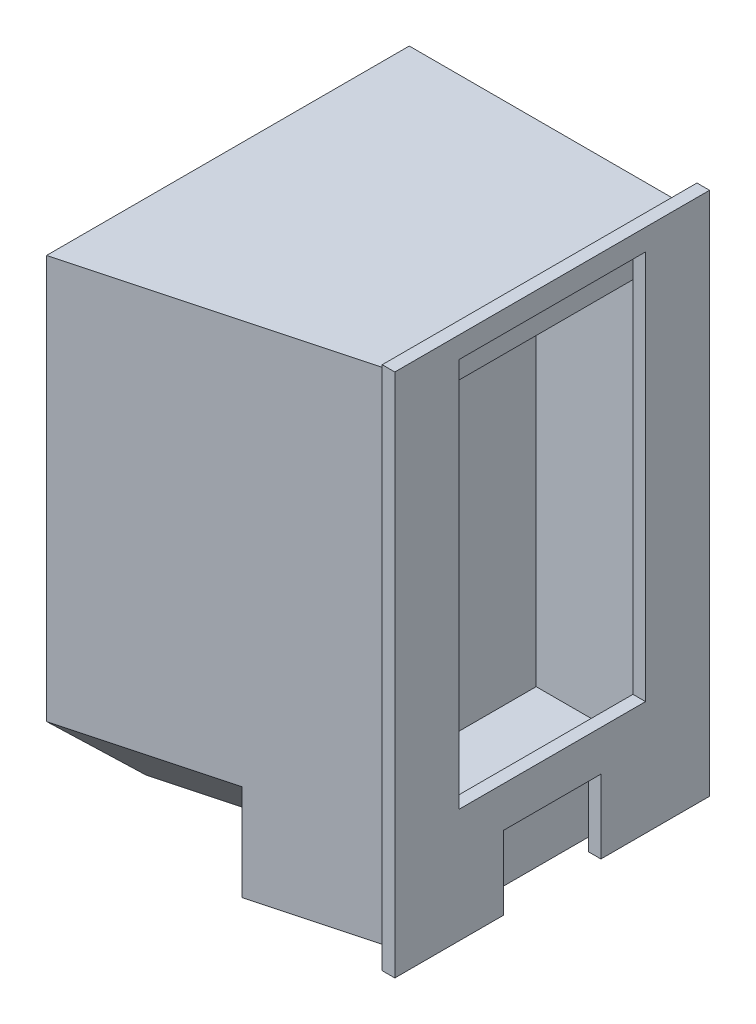
ISO-10303-21;
HEADER;
FILE_DESCRIPTION(('STEP AP214'),'2;1');
FILE_NAME('part.step','',(''),(''),'','','');
FILE_SCHEMA(('AUTOMOTIVE_DESIGN { 1 0 10303 214 1 1 1 1 }'));
ENDSEC;
DATA;
#1=APPLICATION_CONTEXT('core data for automotive mechanical design processes');
#2=APPLICATION_PROTOCOL_DEFINITION('international standard','automotive_design',2000,#1);
#3=PRODUCT_CONTEXT('',#1,'mechanical');
#4=PRODUCT('Part','Part','',(#3));
#5=PRODUCT_RELATED_PRODUCT_CATEGORY('part','',(#4));
#6=PRODUCT_DEFINITION_FORMATION('','',#4);
#7=PRODUCT_DEFINITION_CONTEXT('part definition',#1,'design');
#8=PRODUCT_DEFINITION('design','',#6,#7);
#9=PRODUCT_DEFINITION_SHAPE('','',#8);
#10=(LENGTH_UNIT() NAMED_UNIT(*) SI_UNIT(.MILLI.,.METRE.));
#11=(NAMED_UNIT(*) PLANE_ANGLE_UNIT() SI_UNIT($,.RADIAN.));
#12=(NAMED_UNIT(*) SI_UNIT($,.STERADIAN.) SOLID_ANGLE_UNIT());
#13=UNCERTAINTY_MEASURE_WITH_UNIT(LENGTH_MEASURE(1.E-05),#10,'distance_accuracy_value','');
#14=(GEOMETRIC_REPRESENTATION_CONTEXT(3) GLOBAL_UNCERTAINTY_ASSIGNED_CONTEXT((#13)) GLOBAL_UNIT_ASSIGNED_CONTEXT((#10,
#11,#12)) REPRESENTATION_CONTEXT('',''));
#15=CARTESIAN_POINT('',(0.,0.,0.));
#16=DIRECTION('',(0.,0.,1.));
#17=DIRECTION('',(1.,0.,0.));
#18=AXIS2_PLACEMENT_3D('',#15,#16,#17);
#19=CARTESIAN_POINT('',(15.3052314877297,0.,0.));
#20=DIRECTION('',(1.,0.,0.));
#21=DIRECTION('',(0.,0.,-1.));
#22=AXIS2_PLACEMENT_3D('',#19,#20,#21);
#23=PLANE('',#22);
#24=DIRECTION('',(0.,1.,0.));
#25=VECTOR('',#24,1.);
#26=CARTESIAN_POINT('',(15.3052314877297,521.318653049981,217.579868937785));
#27=LINE('',#26,#25);
#28=CARTESIAN_POINT('',(15.3052314877297,-103.291624688066,217.579868937784));
#29=VERTEX_POINT('',#28);
#30=CARTESIAN_POINT('',(15.3052314877297,521.318653049981,217.579868937785));
#31=VERTEX_POINT('',#30);
#32=EDGE_CURVE('E191',#29,#31,#27,.T.);
#33=ORIENTED_EDGE('',*,*,#32,.T.);
#34=DIRECTION('',(0.,0.,1.));
#35=VECTOR('',#34,1.);
#36=CARTESIAN_POINT('',(15.3052314877297,521.318653049981,217.579868937785));
#37=LINE('',#36,#35);
#38=CARTESIAN_POINT('',(15.3052314877297,521.318653049981,592.157167093429));
#39=VERTEX_POINT('',#38);
#40=EDGE_CURVE('E195',#31,#39,#37,.T.);
#41=ORIENTED_EDGE('',*,*,#40,.T.);
#42=DIRECTION('',(0.,-1.,0.));
#43=VECTOR('',#42,1.);
#44=CARTESIAN_POINT('',(15.3052314877297,521.318653049981,592.157167093429));
#45=LINE('',#44,#43);
#46=CARTESIAN_POINT('',(15.3052314877297,-103.291624688066,592.157167093429));
#47=VERTEX_POINT('',#46);
#48=EDGE_CURVE('E199',#39,#47,#45,.T.);
#49=ORIENTED_EDGE('',*,*,#48,.T.);
#50=DIRECTION('',(0.,0.,-1.));
#51=VECTOR('',#50,1.);
#52=CARTESIAN_POINT('',(15.3052314877297,-103.291624688066,592.157167093429));
#53=LINE('',#52,#51);
#54=CARTESIAN_POINT('',(15.3052314877297,-103.291624688066,462.868518015606));
#55=VERTEX_POINT('',#54);
#56=EDGE_CURVE('E202',#47,#55,#53,.T.);
#57=ORIENTED_EDGE('',*,*,#56,.T.);
#58=DIRECTION('',(0.,1.,0.));
#59=VECTOR('',#58,1.);
#60=CARTESIAN_POINT('',(15.3052314877297,-15.7916246880659,462.868518015606));
#61=LINE('',#60,#59);
#62=CARTESIAN_POINT('',(15.3052314877297,-15.7916246880659,462.868518015606));
#63=VERTEX_POINT('',#62);
#64=EDGE_CURVE('E205',#55,#63,#61,.T.);
#65=ORIENTED_EDGE('',*,*,#64,.T.);
#66=DIRECTION('',(0.,0.,-1.));
#67=VECTOR('',#66,1.);
#68=CARTESIAN_POINT('',(15.3052314877297,-15.7916246880659,462.868518015606));
#69=LINE('',#68,#67);
#70=CARTESIAN_POINT('',(15.3052314877297,-15.7916246880659,346.868518015606));
#71=VERTEX_POINT('',#70);
#72=EDGE_CURVE('E208',#63,#71,#69,.T.);
#73=ORIENTED_EDGE('',*,*,#72,.T.);
#74=DIRECTION('',(0.,-1.,0.));
#75=VECTOR('',#74,1.);
#76=CARTESIAN_POINT('',(15.3052314877297,-15.7916246880659,346.868518015606));
#77=LINE('',#76,#75);
#78=CARTESIAN_POINT('',(15.3052314877297,-103.291624688066,346.868518015606));
#79=VERTEX_POINT('',#78);
#80=EDGE_CURVE('E211',#71,#79,#77,.T.);
#81=ORIENTED_EDGE('',*,*,#80,.T.);
#82=DIRECTION('',(0.,0.,-1.));
#83=VECTOR('',#82,1.);
#84=CARTESIAN_POINT('',(15.3052314877297,-103.291624688066,346.868518015606));
#85=LINE('',#84,#83);
#86=EDGE_CURVE('E214',#79,#29,#85,.T.);
#87=ORIENTED_EDGE('',*,*,#86,.T.);
#88=EDGE_LOOP('',(#33,#41,#49,#57,#65,#73,#81,#87));
#89=FACE_BOUND('',#88,.T.);
#90=DIRECTION('',(0.,0.,-1.));
#91=VECTOR('',#90,1.);
#92=CARTESIAN_POINT('',(15.3052314877297,32.3686530499808,293.743518015606));
#93=LINE('',#92,#91);
#94=CARTESIAN_POINT('',(15.3052314877297,32.3686530499807,515.993518015607));
#95=VERTEX_POINT('',#94);
#96=CARTESIAN_POINT('',(15.3052314877297,32.3686530499808,293.743518015606));
#97=VERTEX_POINT('',#96);
#98=EDGE_CURVE('E152',#95,#97,#93,.T.);
#99=ORIENTED_EDGE('',*,*,#98,.F.);
#100=DIRECTION('',(0.,-1.,0.));
#101=VECTOR('',#100,1.);
#102=CARTESIAN_POINT('',(15.3052314877297,32.3686530499807,515.993518015607));
#103=LINE('',#102,#101);
#104=CARTESIAN_POINT('',(15.3052314877297,495.918653049981,515.993518015606));
#105=VERTEX_POINT('',#104);
#106=EDGE_CURVE('E143',#105,#95,#103,.T.);
#107=ORIENTED_EDGE('',*,*,#106,.F.);
#108=DIRECTION('',(0.,0.,1.));
#109=VECTOR('',#108,1.);
#110=CARTESIAN_POINT('',(15.3052314877297,495.918653049981,293.743518015606));
#111=LINE('',#110,#109);
#112=CARTESIAN_POINT('',(15.3052314877297,495.918653049981,293.743518015606));
#113=VERTEX_POINT('',#112);
#114=EDGE_CURVE('E169',#113,#105,#111,.T.);
#115=ORIENTED_EDGE('',*,*,#114,.F.);
#116=DIRECTION('',(0.,1.,0.));
#117=VECTOR('',#116,1.);
#118=CARTESIAN_POINT('',(15.3052314877297,32.3686530499808,293.743518015606));
#119=LINE('',#118,#117);
#120=EDGE_CURVE('E165',#97,#113,#119,.T.);
#121=ORIENTED_EDGE('',*,*,#120,.F.);
#122=EDGE_LOOP('',(#99,#107,#115,#121));
#123=FACE_BOUND('',#122,.T.);
#124=ADVANCED_FACE('F53',(#89,#123),#23,.T.);
#125=CARTESIAN_POINT('',(0.305231487729651,0.,0.));
#126=DIRECTION('',(1.,0.,0.));
#127=DIRECTION('',(0.,0.,-1.));
#128=AXIS2_PLACEMENT_3D('',#125,#126,#127);
#129=PLANE('',#128);
#130=DIRECTION('',(0.,1.,0.));
#131=VECTOR('',#130,1.);
#132=CARTESIAN_POINT('',(0.305231487729651,521.318653049981,217.579868937785));
#133=LINE('',#132,#131);
#134=CARTESIAN_POINT('',(0.305231487729651,-103.291624688066,217.579868937784));
#135=VERTEX_POINT('',#134);
#136=CARTESIAN_POINT('',(0.305231487729651,521.318653049981,217.579868937785));
#137=VERTEX_POINT('',#136);
#138=EDGE_CURVE('E161',#135,#137,#133,.T.);
#139=ORIENTED_EDGE('',*,*,#138,.F.);
#140=DIRECTION('',(0.,0.,-1.));
#141=VECTOR('',#140,1.);
#142=CARTESIAN_POINT('',(0.305231487729651,-103.291624688066,346.868518015606));
#143=LINE('',#142,#141);
#144=CARTESIAN_POINT('',(0.305231487729651,-103.291624688066,346.868518015606));
#145=VERTEX_POINT('',#144);
#146=EDGE_CURVE('E196',#145,#135,#143,.T.);
#147=ORIENTED_EDGE('',*,*,#146,.F.);
#148=DIRECTION('',(0.,-1.,0.));
#149=VECTOR('',#148,1.);
#150=CARTESIAN_POINT('',(0.305231487729651,-15.7916246880659,346.868518015606));
#151=LINE('',#150,#149);
#152=CARTESIAN_POINT('',(0.305231487729651,-15.7916246880659,346.868518015606));
#153=VERTEX_POINT('',#152);
#154=EDGE_CURVE('E236',#153,#145,#151,.T.);
#155=ORIENTED_EDGE('',*,*,#154,.F.);
#156=DIRECTION('',(0.,0.,-1.));
#157=VECTOR('',#156,1.);
#158=CARTESIAN_POINT('',(0.305231487729651,-15.7916246880659,462.868518015606));
#159=LINE('',#158,#157);
#160=CARTESIAN_POINT('',(0.305231487729651,-15.7916246880659,462.868518015606));
#161=VERTEX_POINT('',#160);
#162=EDGE_CURVE('E233',#161,#153,#159,.T.);
#163=ORIENTED_EDGE('',*,*,#162,.F.);
#164=DIRECTION('',(0.,1.,0.));
#165=VECTOR('',#164,1.);
#166=CARTESIAN_POINT('',(0.305231487729651,-15.7916246880659,462.868518015606));
#167=LINE('',#166,#165);
#168=CARTESIAN_POINT('',(0.305231487729651,-103.291624688066,462.868518015606));
#169=VERTEX_POINT('',#168);
#170=EDGE_CURVE('E230',#169,#161,#167,.T.);
#171=ORIENTED_EDGE('',*,*,#170,.F.);
#172=DIRECTION('',(0.,0.,-1.));
#173=VECTOR('',#172,1.);
#174=CARTESIAN_POINT('',(0.305231487729651,-103.291624688066,592.157167093429));
#175=LINE('',#174,#173);
#176=CARTESIAN_POINT('',(0.305231487729651,-103.291624688066,592.157167093429));
#177=VERTEX_POINT('',#176);
#178=EDGE_CURVE('E227',#177,#169,#175,.T.);
#179=ORIENTED_EDGE('',*,*,#178,.F.);
#180=DIRECTION('',(0.,-1.,0.));
#181=VECTOR('',#180,1.);
#182=CARTESIAN_POINT('',(0.305231487729651,521.318653049981,592.157167093429));
#183=LINE('',#182,#181);
#184=CARTESIAN_POINT('',(0.305231487729651,521.318653049981,592.157167093429));
#185=VERTEX_POINT('',#184);
#186=EDGE_CURVE('E224',#185,#177,#183,.T.);
#187=ORIENTED_EDGE('',*,*,#186,.F.);
#188=DIRECTION('',(0.,0.,1.));
#189=VECTOR('',#188,1.);
#190=CARTESIAN_POINT('',(0.305231487729651,521.318653049981,217.579868937785));
#191=LINE('',#190,#189);
#192=EDGE_CURVE('E221',#137,#185,#191,.T.);
#193=ORIENTED_EDGE('',*,*,#192,.F.);
#194=EDGE_LOOP('',(#139,#147,#155,#163,#171,#179,#187,#193));
#195=FACE_BOUND('',#194,.T.);
#196=DIRECTION('',(0.,-1.,0.));
#197=VECTOR('',#196,1.);
#198=CARTESIAN_POINT('',(0.305231487729651,32.3686530499807,515.993518015607));
#199=LINE('',#198,#197);
#200=CARTESIAN_POINT('',(0.305231487729651,495.918653049981,515.993518015606));
#201=VERTEX_POINT('',#200);
#202=CARTESIAN_POINT('',(0.305231487729651,32.3686530499807,515.993518015607));
#203=VERTEX_POINT('',#202);
#204=EDGE_CURVE('E77',#201,#203,#199,.T.);
#205=ORIENTED_EDGE('',*,*,#204,.T.);
#206=DIRECTION('',(0.,0.,-1.));
#207=VECTOR('',#206,1.);
#208=CARTESIAN_POINT('',(0.305231487729651,32.3686530499808,293.743518015606));
#209=LINE('',#208,#207);
#210=CARTESIAN_POINT('',(0.305231487729651,32.3686530499808,293.743518015606));
#211=VERTEX_POINT('',#210);
#212=EDGE_CURVE('E159',#203,#211,#209,.T.);
#213=ORIENTED_EDGE('',*,*,#212,.T.);
#214=DIRECTION('',(0.,1.,0.));
#215=VECTOR('',#214,1.);
#216=CARTESIAN_POINT('',(0.305231487729651,32.3686530499808,293.743518015606));
#217=LINE('',#216,#215);
#218=CARTESIAN_POINT('',(0.305231487729651,495.918653049981,293.743518015606));
#219=VERTEX_POINT('',#218);
#220=EDGE_CURVE('E178',#211,#219,#217,.T.);
#221=ORIENTED_EDGE('',*,*,#220,.T.);
#222=DIRECTION('',(0.,0.,1.));
#223=VECTOR('',#222,1.);
#224=CARTESIAN_POINT('',(0.305231487729651,495.918653049981,293.743518015606));
#225=LINE('',#224,#223);
#226=EDGE_CURVE('E153',#219,#201,#225,.T.);
#227=ORIENTED_EDGE('',*,*,#226,.T.);
#228=EDGE_LOOP('',(#205,#213,#221,#227));
#229=FACE_BOUND('',#228,.T.);
#230=ADVANCED_FACE('F275',(#195,#229),#129,.F.);
#231=CARTESIAN_POINT('',(15.3052314877297,521.318653049981,217.579868937785));
#232=DIRECTION('',(0.,0.,1.));
#233=DIRECTION('',(0.,-1.,0.));
#234=AXIS2_PLACEMENT_3D('',#231,#232,#233);
#235=PLANE('',#234);
#236=ORIENTED_EDGE('',*,*,#138,.T.);
#237=DIRECTION('',(-1.,0.,0.));
#238=VECTOR('',#237,1.);
#239=CARTESIAN_POINT('',(15.3052314877297,521.318653049981,217.579868937785));
#240=LINE('',#239,#238);
#241=EDGE_CURVE('E12',#31,#137,#240,.T.);
#242=ORIENTED_EDGE('',*,*,#241,.F.);
#243=ORIENTED_EDGE('',*,*,#32,.F.);
#244=DIRECTION('',(-1.,0.,0.));
#245=VECTOR('',#244,1.);
#246=CARTESIAN_POINT('',(15.3052314877297,-103.291624688066,217.579868937784));
#247=LINE('',#246,#245);
#248=EDGE_CURVE('E217',#29,#135,#247,.T.);
#249=ORIENTED_EDGE('',*,*,#248,.T.);
#250=EDGE_LOOP('',(#236,#242,#243,#249));
#251=FACE_BOUND('',#250,.T.);
#252=ADVANCED_FACE('F55',(#251),#235,.F.);
#253=CARTESIAN_POINT('',(15.3052314877297,521.318653049981,217.579868937785));
#254=DIRECTION('',(0.,-1.,0.));
#255=DIRECTION('',(0.,0.,-1.));
#256=AXIS2_PLACEMENT_3D('',#253,#254,#255);
#257=PLANE('',#256);
#258=ORIENTED_EDGE('',*,*,#192,.T.);
#259=DIRECTION('',(-1.,0.,0.));
#260=VECTOR('',#259,1.);
#261=CARTESIAN_POINT('',(15.3052314877297,521.318653049981,592.157167093429));
#262=LINE('',#261,#260);
#263=EDGE_CURVE('E62',#39,#185,#262,.T.);
#264=ORIENTED_EDGE('',*,*,#263,.F.);
#265=ORIENTED_EDGE('',*,*,#40,.F.);
#266=ORIENTED_EDGE('',*,*,#241,.T.);
#267=EDGE_LOOP('',(#258,#264,#265,#266));
#268=FACE_BOUND('',#267,.T.);
#269=ADVANCED_FACE('F292',(#268),#257,.F.);
#270=CARTESIAN_POINT('',(15.3052314877297,521.318653049981,592.157167093429));
#271=DIRECTION('',(0.,0.,-1.));
#272=DIRECTION('',(0.,1.,0.));
#273=AXIS2_PLACEMENT_3D('',#270,#271,#272);
#274=PLANE('',#273);
#275=ORIENTED_EDGE('',*,*,#186,.T.);
#276=DIRECTION('',(-1.,0.,0.));
#277=VECTOR('',#276,1.);
#278=CARTESIAN_POINT('',(15.3052314877297,-103.291624688066,592.157167093429));
#279=LINE('',#278,#277);
#280=EDGE_CURVE('E260',#47,#177,#279,.T.);
#281=ORIENTED_EDGE('',*,*,#280,.F.);
#282=ORIENTED_EDGE('',*,*,#48,.F.);
#283=ORIENTED_EDGE('',*,*,#263,.T.);
#284=EDGE_LOOP('',(#275,#281,#282,#283));
#285=FACE_BOUND('',#284,.T.);
#286=ADVANCED_FACE('F269',(#285),#274,.F.);
#287=CARTESIAN_POINT('',(15.3052314877297,-103.291624688066,592.157167093429));
#288=DIRECTION('',(0.,1.,0.));
#289=DIRECTION('',(0.,0.,1.));
#290=AXIS2_PLACEMENT_3D('',#287,#288,#289);
#291=PLANE('',#290);
#292=ORIENTED_EDGE('',*,*,#178,.T.);
#293=DIRECTION('',(-1.,0.,0.));
#294=VECTOR('',#293,1.);
#295=CARTESIAN_POINT('',(15.3052314877297,-103.291624688066,462.868518015606));
#296=LINE('',#295,#294);
#297=EDGE_CURVE('E256',#55,#169,#296,.T.);
#298=ORIENTED_EDGE('',*,*,#297,.F.);
#299=ORIENTED_EDGE('',*,*,#56,.F.);
#300=ORIENTED_EDGE('',*,*,#280,.T.);
#301=EDGE_LOOP('',(#292,#298,#299,#300));
#302=FACE_BOUND('',#301,.T.);
#303=ADVANCED_FACE('F281',(#302),#291,.F.);
#304=CARTESIAN_POINT('',(15.3052314877297,-15.7916246880659,462.868518015606));
#305=DIRECTION('',(0.,0.,1.));
#306=DIRECTION('',(1.,0.,0.));
#307=AXIS2_PLACEMENT_3D('',#304,#305,#306);
#308=PLANE('',#307);
#309=ORIENTED_EDGE('',*,*,#170,.T.);
#310=DIRECTION('',(-1.,0.,0.));
#311=VECTOR('',#310,1.);
#312=CARTESIAN_POINT('',(15.3052314877297,-15.7916246880659,462.868518015606));
#313=LINE('',#312,#311);
#314=EDGE_CURVE('E252',#63,#161,#313,.T.);
#315=ORIENTED_EDGE('',*,*,#314,.F.);
#316=ORIENTED_EDGE('',*,*,#64,.F.);
#317=ORIENTED_EDGE('',*,*,#297,.T.);
#318=EDGE_LOOP('',(#309,#315,#316,#317));
#319=FACE_BOUND('',#318,.T.);
#320=ADVANCED_FACE('F285',(#319),#308,.F.);
#321=CARTESIAN_POINT('',(15.3052314877297,-15.7916246880659,462.868518015606));
#322=DIRECTION('',(0.,1.,0.));
#323=DIRECTION('',(0.,0.,1.));
#324=AXIS2_PLACEMENT_3D('',#321,#322,#323);
#325=PLANE('',#324);
#326=ORIENTED_EDGE('',*,*,#162,.T.);
#327=DIRECTION('',(-1.,0.,0.));
#328=VECTOR('',#327,1.);
#329=CARTESIAN_POINT('',(15.3052314877297,-15.7916246880659,346.868518015606));
#330=LINE('',#329,#328);
#331=EDGE_CURVE('E248',#71,#153,#330,.T.);
#332=ORIENTED_EDGE('',*,*,#331,.F.);
#333=ORIENTED_EDGE('',*,*,#72,.F.);
#334=ORIENTED_EDGE('',*,*,#314,.T.);
#335=EDGE_LOOP('',(#326,#332,#333,#334));
#336=FACE_BOUND('',#335,.T.);
#337=ADVANCED_FACE('F305',(#336),#325,.F.);
#338=CARTESIAN_POINT('',(15.3052314877297,-15.7916246880659,346.868518015606));
#339=DIRECTION('',(0.,0.,-1.));
#340=DIRECTION('',(-1.,0.,0.));
#341=AXIS2_PLACEMENT_3D('',#338,#339,#340);
#342=PLANE('',#341);
#343=ORIENTED_EDGE('',*,*,#154,.T.);
#344=DIRECTION('',(-1.,0.,0.));
#345=VECTOR('',#344,1.);
#346=CARTESIAN_POINT('',(15.3052314877297,-103.291624688066,346.868518015606));
#347=LINE('',#346,#345);
#348=EDGE_CURVE('E244',#79,#145,#347,.T.);
#349=ORIENTED_EDGE('',*,*,#348,.F.);
#350=ORIENTED_EDGE('',*,*,#80,.F.);
#351=ORIENTED_EDGE('',*,*,#331,.T.);
#352=EDGE_LOOP('',(#343,#349,#350,#351));
#353=FACE_BOUND('',#352,.T.);
#354=ADVANCED_FACE('F303',(#353),#342,.F.);
#355=CARTESIAN_POINT('',(15.3052314877297,-103.291624688066,346.868518015606));
#356=DIRECTION('',(0.,1.,0.));
#357=DIRECTION('',(0.,0.,1.));
#358=AXIS2_PLACEMENT_3D('',#355,#356,#357);
#359=PLANE('',#358);
#360=ORIENTED_EDGE('',*,*,#146,.T.);
#361=ORIENTED_EDGE('',*,*,#248,.F.);
#362=ORIENTED_EDGE('',*,*,#86,.F.);
#363=ORIENTED_EDGE('',*,*,#348,.T.);
#364=EDGE_LOOP('',(#360,#361,#362,#363));
#365=FACE_BOUND('',#364,.T.);
#366=ADVANCED_FACE('F298',(#365),#359,.F.);
#367=CARTESIAN_POINT('',(15.3052314877297,32.3686530499807,515.993518015607));
#368=DIRECTION('',(0.,0.,-1.));
#369=DIRECTION('',(0.,1.,0.));
#370=AXIS2_PLACEMENT_3D('',#367,#368,#369);
#371=PLANE('',#370);
#372=ORIENTED_EDGE('',*,*,#204,.F.);
#373=DIRECTION('',(-1.,0.,0.));
#374=VECTOR('',#373,1.);
#375=CARTESIAN_POINT('',(15.3052314877297,495.918653049981,515.993518015606));
#376=LINE('',#375,#374);
#377=EDGE_CURVE('E147',#105,#201,#376,.T.);
#378=ORIENTED_EDGE('',*,*,#377,.F.);
#379=ORIENTED_EDGE('',*,*,#106,.T.);
#380=DIRECTION('',(-1.,0.,0.));
#381=VECTOR('',#380,1.);
#382=CARTESIAN_POINT('',(15.3052314877297,32.3686530499807,515.993518015607));
#383=LINE('',#382,#381);
#384=EDGE_CURVE('E146',#95,#203,#383,.T.);
#385=ORIENTED_EDGE('',*,*,#384,.T.);
#386=EDGE_LOOP('',(#372,#378,#379,#385));
#387=FACE_BOUND('',#386,.T.);
#388=ADVANCED_FACE('F145',(#387),#371,.T.);
#389=CARTESIAN_POINT('',(15.3052314877297,32.3686530499808,293.743518015606));
#390=DIRECTION('',(0.,1.,0.));
#391=DIRECTION('',(0.,0.,1.));
#392=AXIS2_PLACEMENT_3D('',#389,#390,#391);
#393=PLANE('',#392);
#394=ORIENTED_EDGE('',*,*,#212,.F.);
#395=ORIENTED_EDGE('',*,*,#384,.F.);
#396=ORIENTED_EDGE('',*,*,#98,.T.);
#397=DIRECTION('',(-1.,0.,0.));
#398=VECTOR('',#397,1.);
#399=CARTESIAN_POINT('',(15.3052314877297,32.3686530499808,293.743518015606));
#400=LINE('',#399,#398);
#401=EDGE_CURVE('E162',#97,#211,#400,.T.);
#402=ORIENTED_EDGE('',*,*,#401,.T.);
#403=EDGE_LOOP('',(#394,#395,#396,#402));
#404=FACE_BOUND('',#403,.T.);
#405=ADVANCED_FACE('F156',(#404),#393,.T.);
#406=CARTESIAN_POINT('',(15.3052314877297,32.3686530499808,293.743518015606));
#407=DIRECTION('',(0.,0.,1.));
#408=DIRECTION('',(0.,-1.,0.));
#409=AXIS2_PLACEMENT_3D('',#406,#407,#408);
#410=PLANE('',#409);
#411=ORIENTED_EDGE('',*,*,#220,.F.);
#412=ORIENTED_EDGE('',*,*,#401,.F.);
#413=ORIENTED_EDGE('',*,*,#120,.T.);
#414=DIRECTION('',(-1.,0.,0.));
#415=VECTOR('',#414,1.);
#416=CARTESIAN_POINT('',(15.3052314877297,495.918653049981,293.743518015606));
#417=LINE('',#416,#415);
#418=EDGE_CURVE('E69',#113,#219,#417,.T.);
#419=ORIENTED_EDGE('',*,*,#418,.T.);
#420=EDGE_LOOP('',(#411,#412,#413,#419));
#421=FACE_BOUND('',#420,.T.);
#422=ADVANCED_FACE('F330',(#421),#410,.T.);
#423=CARTESIAN_POINT('',(15.3052314877297,495.918653049981,293.743518015606));
#424=DIRECTION('',(0.,-1.,0.));
#425=DIRECTION('',(0.,0.,-1.));
#426=AXIS2_PLACEMENT_3D('',#423,#424,#425);
#427=PLANE('',#426);
#428=ORIENTED_EDGE('',*,*,#226,.F.);
#429=ORIENTED_EDGE('',*,*,#418,.F.);
#430=ORIENTED_EDGE('',*,*,#114,.T.);
#431=ORIENTED_EDGE('',*,*,#377,.T.);
#432=EDGE_LOOP('',(#428,#429,#430,#431));
#433=FACE_BOUND('',#432,.T.);
#434=ADVANCED_FACE('F334',(#433),#427,.T.);
#435=CLOSED_SHELL('',(#124,#230,#252,#269,#286,#303,#320,#337,#354,#366,#388,#405,#422,#434));
#436=MANIFOLD_SOLID_BREP('B2',#435);
#437=CARTESIAN_POINT('',(-327.080348727841,506.318653049981,232.579868937784));
#438=DIRECTION('',(1.,0.,0.));
#439=DIRECTION('',(0.,0.,-1.));
#440=AXIS2_PLACEMENT_3D('',#437,#438,#439);
#441=PLANE('',#440);
#442=DIRECTION('',(0.,0.,-1.));
#443=VECTOR('',#442,1.);
#444=CARTESIAN_POINT('',(-327.080348727841,21.2583753119342,573.479868937784));
#445=LINE('',#444,#443);
#446=CARTESIAN_POINT('',(-327.080348727841,21.2583753119341,573.479868937784));
#447=VERTEX_POINT('',#446);
#448=CARTESIAN_POINT('',(-327.080348727841,21.2583753119342,323.479868937785));
#449=VERTEX_POINT('',#448);
#450=EDGE_CURVE('E618',#447,#449,#445,.T.);
#451=ORIENTED_EDGE('',*,*,#450,.T.);
#452=DIRECTION('',(0.,1.,0.));
#453=VECTOR('',#452,1.);
#454=CARTESIAN_POINT('',(-327.080348727841,221.258375311934,323.479868937785));
#455=LINE('',#454,#453);
#456=CARTESIAN_POINT('',(-327.080348727841,221.258375311934,323.479868937785));
#457=VERTEX_POINT('',#456);
#458=EDGE_CURVE('E638',#449,#457,#455,.T.);
#459=ORIENTED_EDGE('',*,*,#458,.T.);
#460=DIRECTION('',(0.,0.,1.));
#461=VECTOR('',#460,1.);
#462=CARTESIAN_POINT('',(-327.080348727841,221.258375311934,573.479868937784));
#463=LINE('',#462,#461);
#464=CARTESIAN_POINT('',(-327.080348727841,221.258375311934,573.479868937784));
#465=VERTEX_POINT('',#464);
#466=EDGE_CURVE('E641',#457,#465,#463,.T.);
#467=ORIENTED_EDGE('',*,*,#466,.T.);
#468=DIRECTION('',(0.,-1.,0.));
#469=VECTOR('',#468,1.);
#470=CARTESIAN_POINT('',(-327.080348727841,221.258375311934,573.479868937784));
#471=LINE('',#470,#469);
#472=EDGE_CURVE('E629',#465,#447,#471,.T.);
#473=ORIENTED_EDGE('',*,*,#472,.T.);
#474=EDGE_LOOP('',(#451,#459,#467,#473));
#475=FACE_BOUND('',#474,.T.);
#476=DIRECTION('',(0.,0.,1.));
#477=VECTOR('',#476,1.);
#478=CARTESIAN_POINT('',(-327.080348727841,350.023375311934,498.479868937784));
#479=LINE('',#478,#477);
#480=CARTESIAN_POINT('',(-327.080348727841,350.023375311934,398.479868937784));
#481=VERTEX_POINT('',#480);
#482=CARTESIAN_POINT('',(-327.080348727841,350.023375311934,498.479868937784));
#483=VERTEX_POINT('',#482);
#484=EDGE_CURVE('E608',#481,#483,#479,.T.);
#485=ORIENTED_EDGE('',*,*,#484,.F.);
#486=DIRECTION('',(0.,-1.,0.));
#487=VECTOR('',#486,1.);
#488=CARTESIAN_POINT('',(-327.080348727841,350.023375311934,398.479868937784));
#489=LINE('',#488,#487);
#490=CARTESIAN_POINT('',(-327.080348727841,450.023375311934,398.479868937784));
#491=VERTEX_POINT('',#490);
#492=EDGE_CURVE('E591',#491,#481,#489,.T.);
#493=ORIENTED_EDGE('',*,*,#492,.F.);
#494=DIRECTION('',(0.,0.,-1.));
#495=VECTOR('',#494,1.);
#496=CARTESIAN_POINT('',(-327.080348727841,450.023375311934,498.479868937784));
#497=LINE('',#496,#495);
#498=CARTESIAN_POINT('',(-327.080348727841,450.023375311934,498.479868937784));
#499=VERTEX_POINT('',#498);
#500=EDGE_CURVE('E597',#499,#491,#497,.T.);
#501=ORIENTED_EDGE('',*,*,#500,.F.);
#502=DIRECTION('',(0.,1.,0.));
#503=VECTOR('',#502,1.);
#504=CARTESIAN_POINT('',(-327.080348727841,350.023375311934,498.479868937784));
#505=LINE('',#504,#503);
#506=EDGE_CURVE('E611',#483,#499,#505,.T.);
#507=ORIENTED_EDGE('',*,*,#506,.F.);
#508=EDGE_LOOP('',(#485,#493,#501,#507));
#509=FACE_BOUND('',#508,.T.);
#510=DIRECTION('',(0.,-0.694746590606866,-0.719254596676403));
#511=VECTOR('',#510,1.);
#512=CARTESIAN_POINT('',(-327.080348727841,42.0707727069249,681.008886361099));
#513=LINE('',#512,#511);
#514=CARTESIAN_POINT('',(-327.080348727841,26.0083753119342,664.379868937784));
#515=VERTEX_POINT('',#514);
#516=CARTESIAN_POINT('',(-327.080348727841,-88.2916246880659,546.047801516912));
#517=VERTEX_POINT('',#516);
#518=EDGE_CURVE('E576',#515,#517,#513,.T.);
#519=ORIENTED_EDGE('',*,*,#518,.F.);
#520=DIRECTION('',(0.,-1.,0.));
#521=VECTOR('',#520,1.);
#522=CARTESIAN_POINT('',(-327.080348727841,506.318653049981,664.379868937784));
#523=LINE('',#522,#521);
#524=CARTESIAN_POINT('',(-327.080348727841,506.318653049981,664.379868937784));
#525=VERTEX_POINT('',#524);
#526=EDGE_CURVE('E51',#525,#515,#523,.T.);
#527=ORIENTED_EDGE('',*,*,#526,.F.);
#528=DIRECTION('',(0.,0.,1.));
#529=VECTOR('',#528,1.);
#530=CARTESIAN_POINT('',(-327.080348727841,506.318653049981,232.579868937784));
#531=LINE('',#530,#529);
#532=CARTESIAN_POINT('',(-327.080348727841,506.318653049981,232.579868937784));
#533=VERTEX_POINT('',#532);
#534=EDGE_CURVE('E688',#533,#525,#531,.T.);
#535=ORIENTED_EDGE('',*,*,#534,.F.);
#536=DIRECTION('',(0.,-1.,0.));
#537=VECTOR('',#536,1.);
#538=CARTESIAN_POINT('',(-327.080348727841,506.318653049981,232.579868937784));
#539=LINE('',#538,#537);
#540=CARTESIAN_POINT('',(-327.080348727841,26.0083753119342,232.579868937784));
#541=VERTEX_POINT('',#540);
#542=EDGE_CURVE('E698',#533,#541,#539,.T.);
#543=ORIENTED_EDGE('',*,*,#542,.T.);
#544=DIRECTION('',(0.,0.707106781186548,-0.707106781186548));
#545=VECTOR('',#544,1.);
#546=CARTESIAN_POINT('',(-327.080348727841,26.0083753119342,232.579868937784));
#547=LINE('',#546,#545);
#548=CARTESIAN_POINT('',(-327.080348727841,-88.2916246880658,346.879868937784));
#549=VERTEX_POINT('',#548);
#550=EDGE_CURVE('E580',#549,#541,#547,.T.);
#551=ORIENTED_EDGE('',*,*,#550,.F.);
#552=DIRECTION('',(0.,0.,1.));
#553=VECTOR('',#552,1.);
#554=CARTESIAN_POINT('',(-327.080348727841,-88.2916246880658,232.579868937784));
#555=LINE('',#554,#553);
#556=EDGE_CURVE('E681',#549,#517,#555,.T.);
#557=ORIENTED_EDGE('',*,*,#556,.T.);
#558=EDGE_LOOP('',(#519,#527,#535,#543,#551,#557));
#559=FACE_BOUND('',#558,.T.);
#560=ADVANCED_FACE('F423',(#475,#509,#559),#441,.F.);
#561=CARTESIAN_POINT('',(-327.080348727841,506.318653049981,664.379868937784));
#562=DIRECTION('',(-0.258819045102518,0.,-0.965925826289069));
#563=DIRECTION('',(-0.965925826289069,0.,0.258819045102518));
#564=AXIS2_PLACEMENT_3D('',#561,#562,#563);
#565=PLANE('',#564);
#566=DIRECTION('',(-0.965925826289069,0.,0.258819045102518));
#567=VECTOR('',#566,1.);
#568=CARTESIAN_POINT('',(-143.554441732918,26.0083753119342,615.204250368306));
#569=LINE('',#568,#567);
#570=CARTESIAN_POINT('',(-143.554441732918,26.0083753119342,615.204250368306));
#571=VERTEX_POINT('',#570);
#572=EDGE_CURVE('E561',#571,#515,#569,.T.);
#573=ORIENTED_EDGE('',*,*,#572,.F.);
#574=DIRECTION('',(0.,-1.,0.));
#575=VECTOR('',#574,1.);
#576=CARTESIAN_POINT('',(-143.554441732918,-88.2916246880658,615.204250368306));
#577=LINE('',#576,#575);
#578=CARTESIAN_POINT('',(-143.554441732918,-88.2916246880658,615.204250368306));
#579=VERTEX_POINT('',#578);
#580=EDGE_CURVE('E565',#571,#579,#577,.T.);
#581=ORIENTED_EDGE('',*,*,#580,.T.);
#582=DIRECTION('',(0.965925826289069,0.,-0.258819045102518));
#583=VECTOR('',#582,1.);
#584=CARTESIAN_POINT('',(-327.080348727841,-88.2916246880658,664.379868937784));
#585=LINE('',#584,#583);
#586=CARTESIAN_POINT('',(0.305231487729651,-88.2916246880658,576.657167105429));
#587=VERTEX_POINT('',#586);
#588=EDGE_CURVE('E701',#579,#587,#585,.T.);
#589=ORIENTED_EDGE('',*,*,#588,.T.);
#590=DIRECTION('',(0.,-1.,0.));
#591=VECTOR('',#590,1.);
#592=CARTESIAN_POINT('',(0.305231487729651,506.318653049981,576.657167105429));
#593=LINE('',#592,#591);
#594=CARTESIAN_POINT('',(0.305231487729651,506.318653049981,576.657167105429));
#595=VERTEX_POINT('',#594);
#596=EDGE_CURVE('E430',#595,#587,#593,.T.);
#597=ORIENTED_EDGE('',*,*,#596,.F.);
#598=DIRECTION('',(0.965925826289069,0.,-0.258819045102518));
#599=VECTOR('',#598,1.);
#600=CARTESIAN_POINT('',(-327.080348727841,506.318653049981,664.379868937784));
#601=LINE('',#600,#599);
#602=EDGE_CURVE('E691',#525,#595,#601,.T.);
#603=ORIENTED_EDGE('',*,*,#602,.F.);
#604=ORIENTED_EDGE('',*,*,#526,.T.);
#605=EDGE_LOOP('',(#573,#581,#589,#597,#603,#604));
#606=FACE_BOUND('',#605,.T.);
#607=ADVANCED_FACE('F573',(#606),#565,.F.);
#608=CARTESIAN_POINT('',(-327.080348727841,-88.2916246880658,232.579868937784));
#609=DIRECTION('',(0.,-1.,0.));
#610=DIRECTION('',(0.,0.,-1.));
#611=AXIS2_PLACEMENT_3D('',#608,#609,#610);
#612=PLANE('',#611);
#613=DIRECTION('',(-0.258819045102518,0.,-0.965925826289069));
#614=VECTOR('',#613,1.);
#615=CARTESIAN_POINT('',(-173.137458588136,-88.2916246880659,504.798928423465));
#616=LINE('',#615,#614);
#617=CARTESIAN_POINT('',(-173.137458588136,-88.2916246880658,504.798928423465));
#618=VERTEX_POINT('',#617);
#619=EDGE_CURVE('E566',#579,#618,#616,.T.);
#620=ORIENTED_EDGE('',*,*,#619,.T.);
#621=DIRECTION('',(-0.965925826289069,0.,0.258819045102518));
#622=VECTOR('',#621,1.);
#623=CARTESIAN_POINT('',(-173.137458588136,-88.2916246880659,504.798928423465));
#624=LINE('',#623,#622);
#625=EDGE_CURVE('E437',#618,#517,#624,.T.);
#626=ORIENTED_EDGE('',*,*,#625,.T.);
#627=ORIENTED_EDGE('',*,*,#556,.F.);
#628=DIRECTION('',(-1.,0.,0.));
#629=VECTOR('',#628,1.);
#630=CARTESIAN_POINT('',(-155.080348727841,-88.2916246880658,346.879868937784));
#631=LINE('',#630,#629);
#632=CARTESIAN_POINT('',(-155.080348727841,-88.2916246880658,346.879868937784));
#633=VERTEX_POINT('',#632);
#634=EDGE_CURVE('E586',#633,#549,#631,.T.);
#635=ORIENTED_EDGE('',*,*,#634,.F.);
#636=DIRECTION('',(0.,0.,1.));
#637=VECTOR('',#636,1.);
#638=CARTESIAN_POINT('',(-155.080348727841,-88.2916246880658,346.879868937784));
#639=LINE('',#638,#637);
#640=CARTESIAN_POINT('',(-155.080348727841,-88.2916246880658,232.579868937784));
#641=VERTEX_POINT('',#640);
#642=EDGE_CURVE('E582',#641,#633,#639,.T.);
#643=ORIENTED_EDGE('',*,*,#642,.F.);
#644=DIRECTION('',(-1.,0.,0.));
#645=VECTOR('',#644,1.);
#646=CARTESIAN_POINT('',(0.305231487729651,-88.2916246880658,232.579868937784));
#647=LINE('',#646,#645);
#648=CARTESIAN_POINT('',(0.305231487729651,-88.2916246880658,232.579868937784));
#649=VERTEX_POINT('',#648);
#650=EDGE_CURVE('E692',#649,#641,#647,.T.);
#651=ORIENTED_EDGE('',*,*,#650,.F.);
#652=DIRECTION('',(0.,0.,-1.));
#653=VECTOR('',#652,1.);
#654=CARTESIAN_POINT('',(0.305231487729651,-88.2916246880658,576.657167105429));
#655=LINE('',#654,#653);
#656=EDGE_CURVE('E703',#587,#649,#655,.T.);
#657=ORIENTED_EDGE('',*,*,#656,.F.);
#658=ORIENTED_EDGE('',*,*,#588,.F.);
#659=EDGE_LOOP('',(#620,#626,#627,#635,#643,#651,#657,#658));
#660=FACE_BOUND('',#659,.T.);
#661=ADVANCED_FACE('F720',(#660),#612,.T.);
#662=CARTESIAN_POINT('',(0.305231487729651,506.318653049981,576.657167105429));
#663=DIRECTION('',(-1.,0.,0.));
#664=DIRECTION('',(0.,0.,1.));
#665=AXIS2_PLACEMENT_3D('',#662,#663,#664);
#666=PLANE('',#665);
#667=DIRECTION('',(0.,0.,-1.));
#668=VECTOR('',#667,1.);
#669=CARTESIAN_POINT('',(0.305231487729651,-29.1371492785861,281.926314259797));
#670=LINE('',#669,#668);
#671=CARTESIAN_POINT('',(0.305231487729651,-29.1371492785861,529.576314259797));
#672=VERTEX_POINT('',#671);
#673=CARTESIAN_POINT('',(0.305231487729651,-29.1371492785861,281.926314259797));
#674=VERTEX_POINT('',#673);
#675=EDGE_CURVE('E671',#672,#674,#670,.T.);
#676=ORIENTED_EDGE('',*,*,#675,.F.);
#677=DIRECTION('',(0.,-1.,0.));
#678=VECTOR('',#677,1.);
#679=CARTESIAN_POINT('',(0.305231487729651,-29.1371492785862,529.576314259797));
#680=LINE('',#679,#678);
#681=CARTESIAN_POINT('',(0.305231487729651,459.812850721414,529.576314259797));
#682=VERTEX_POINT('',#681);
#683=EDGE_CURVE('E655',#682,#672,#680,.T.);
#684=ORIENTED_EDGE('',*,*,#683,.F.);
#685=DIRECTION('',(0.,0.,1.));
#686=VECTOR('',#685,1.);
#687=CARTESIAN_POINT('',(0.305231487729651,459.812850721414,281.926314259797));
#688=LINE('',#687,#686);
#689=CARTESIAN_POINT('',(0.305231487729651,459.812850721414,281.926314259797));
#690=VERTEX_POINT('',#689);
#691=EDGE_CURVE('E660',#690,#682,#688,.T.);
#692=ORIENTED_EDGE('',*,*,#691,.F.);
#693=DIRECTION('',(0.,1.,0.));
#694=VECTOR('',#693,1.);
#695=CARTESIAN_POINT('',(0.305231487729651,-29.1371492785861,281.926314259797));
#696=LINE('',#695,#694);
#697=EDGE_CURVE('E674',#674,#690,#696,.T.);
#698=ORIENTED_EDGE('',*,*,#697,.F.);
#699=EDGE_LOOP('',(#676,#684,#692,#698));
#700=FACE_BOUND('',#699,.T.);
#701=ORIENTED_EDGE('',*,*,#656,.T.);
#702=DIRECTION('',(0.,-1.,0.));
#703=VECTOR('',#702,1.);
#704=CARTESIAN_POINT('',(0.305231487729651,506.318653049981,232.579868937784));
#705=LINE('',#704,#703);
#706=CARTESIAN_POINT('',(0.305231487729651,506.318653049981,232.579868937784));
#707=VERTEX_POINT('',#706);
#708=EDGE_CURVE('E709',#707,#649,#705,.T.);
#709=ORIENTED_EDGE('',*,*,#708,.F.);
#710=DIRECTION('',(0.,0.,-1.));
#711=VECTOR('',#710,1.);
#712=CARTESIAN_POINT('',(0.305231487729651,506.318653049981,576.657167105429));
#713=LINE('',#712,#711);
#714=EDGE_CURVE('E694',#595,#707,#713,.T.);
#715=ORIENTED_EDGE('',*,*,#714,.F.);
#716=ORIENTED_EDGE('',*,*,#596,.T.);
#717=EDGE_LOOP('',(#701,#709,#715,#716));
#718=FACE_BOUND('',#717,.T.);
#719=ADVANCED_FACE('F716',(#700,#718),#666,.F.);
#720=CARTESIAN_POINT('',(0.305231487729651,506.318653049981,232.579868937784));
#721=DIRECTION('',(0.,0.,1.));
#722=DIRECTION('',(1.,0.,0.));
#723=AXIS2_PLACEMENT_3D('',#720,#721,#722);
#724=PLANE('',#723);
#725=DIRECTION('',(0.,-1.,0.));
#726=VECTOR('',#725,1.);
#727=CARTESIAN_POINT('',(-155.080348727841,-88.2916246880658,232.579868937784));
#728=LINE('',#727,#726);
#729=CARTESIAN_POINT('',(-155.080348727841,26.0083753119342,232.579868937784));
#730=VERTEX_POINT('',#729);
#731=EDGE_CURVE('E445',#730,#641,#728,.T.);
#732=ORIENTED_EDGE('',*,*,#731,.F.);
#733=DIRECTION('',(-1.,0.,0.));
#734=VECTOR('',#733,1.);
#735=CARTESIAN_POINT('',(-155.080348727841,26.0083753119342,232.579868937784));
#736=LINE('',#735,#734);
#737=EDGE_CURVE('E588',#730,#541,#736,.T.);
#738=ORIENTED_EDGE('',*,*,#737,.T.);
#739=ORIENTED_EDGE('',*,*,#542,.F.);
#740=DIRECTION('',(-1.,0.,0.));
#741=VECTOR('',#740,1.);
#742=CARTESIAN_POINT('',(0.305231487729651,506.318653049981,232.579868937784));
#743=LINE('',#742,#741);
#744=EDGE_CURVE('E696',#707,#533,#743,.T.);
#745=ORIENTED_EDGE('',*,*,#744,.F.);
#746=ORIENTED_EDGE('',*,*,#708,.T.);
#747=ORIENTED_EDGE('',*,*,#650,.T.);
#748=EDGE_LOOP('',(#732,#738,#739,#745,#746,#747));
#749=FACE_BOUND('',#748,.T.);
#750=ADVANCED_FACE('F723',(#749),#724,.F.);
#751=CARTESIAN_POINT('',(-327.080348727841,506.318653049981,232.579868937784));
#752=DIRECTION('',(0.,-1.,0.));
#753=DIRECTION('',(0.,0.,-1.));
#754=AXIS2_PLACEMENT_3D('',#751,#752,#753);
#755=PLANE('',#754);
#756=ORIENTED_EDGE('',*,*,#534,.T.);
#757=ORIENTED_EDGE('',*,*,#602,.T.);
#758=ORIENTED_EDGE('',*,*,#714,.T.);
#759=ORIENTED_EDGE('',*,*,#744,.T.);
#760=EDGE_LOOP('',(#756,#757,#758,#759));
#761=FACE_BOUND('',#760,.T.);
#762=ADVANCED_FACE('F728',(#761),#755,.F.);
#763=CARTESIAN_POINT('',(-126.69476851227,-29.1371492785862,529.576314259797));
#764=DIRECTION('',(0.,0.,1.));
#765=DIRECTION('',(1.,0.,0.));
#766=AXIS2_PLACEMENT_3D('',#763,#764,#765);
#767=PLANE('',#766);
#768=ORIENTED_EDGE('',*,*,#683,.T.);
#769=DIRECTION('',(1.,0.,0.));
#770=VECTOR('',#769,1.);
#771=CARTESIAN_POINT('',(-126.69476851227,-29.1371492785862,529.576314259797));
#772=LINE('',#771,#770);
#773=CARTESIAN_POINT('',(-126.69476851227,-29.1371492785862,529.576314259797));
#774=VERTEX_POINT('',#773);
#775=EDGE_CURVE('E669',#774,#672,#772,.T.);
#776=ORIENTED_EDGE('',*,*,#775,.F.);
#777=DIRECTION('',(0.,-1.,0.));
#778=VECTOR('',#777,1.);
#779=CARTESIAN_POINT('',(-126.69476851227,-29.1371492785862,529.576314259797));
#780=LINE('',#779,#778);
#781=CARTESIAN_POINT('',(-126.69476851227,459.812850721414,529.576314259797));
#782=VERTEX_POINT('',#781);
#783=EDGE_CURVE('E656',#782,#774,#780,.T.);
#784=ORIENTED_EDGE('',*,*,#783,.F.);
#785=DIRECTION('',(1.,0.,0.));
#786=VECTOR('',#785,1.);
#787=CARTESIAN_POINT('',(-126.69476851227,459.812850721414,529.576314259797));
#788=LINE('',#787,#786);
#789=EDGE_CURVE('E679',#782,#682,#788,.T.);
#790=ORIENTED_EDGE('',*,*,#789,.T.);
#791=EDGE_LOOP('',(#768,#776,#784,#790));
#792=FACE_BOUND('',#791,.T.);
#793=ADVANCED_FACE('F811',(#792),#767,.F.);
#794=CARTESIAN_POINT('',(-126.69476851227,459.812850721414,281.926314259797));
#795=DIRECTION('',(0.,1.,0.));
#796=DIRECTION('',(0.,0.,1.));
#797=AXIS2_PLACEMENT_3D('',#794,#795,#796);
#798=PLANE('',#797);
#799=ORIENTED_EDGE('',*,*,#691,.T.);
#800=ORIENTED_EDGE('',*,*,#789,.F.);
#801=DIRECTION('',(0.,0.,1.));
#802=VECTOR('',#801,1.);
#803=CARTESIAN_POINT('',(-126.69476851227,459.812850721414,281.926314259797));
#804=LINE('',#803,#802);
#805=CARTESIAN_POINT('',(-126.69476851227,459.812850721414,281.926314259797));
#806=VERTEX_POINT('',#805);
#807=EDGE_CURVE('E666',#806,#782,#804,.T.);
#808=ORIENTED_EDGE('',*,*,#807,.F.);
#809=DIRECTION('',(1.,0.,0.));
#810=VECTOR('',#809,1.);
#811=CARTESIAN_POINT('',(-126.69476851227,459.812850721414,281.926314259797));
#812=LINE('',#811,#810);
#813=EDGE_CURVE('E682',#806,#690,#812,.T.);
#814=ORIENTED_EDGE('',*,*,#813,.T.);
#815=EDGE_LOOP('',(#799,#800,#808,#814));
#816=FACE_BOUND('',#815,.T.);
#817=ADVANCED_FACE('F807',(#816),#798,.F.);
#818=CARTESIAN_POINT('',(-126.69476851227,-29.1371492785861,281.926314259797));
#819=DIRECTION('',(0.,0.,-1.));
#820=DIRECTION('',(-1.,0.,0.));
#821=AXIS2_PLACEMENT_3D('',#818,#819,#820);
#822=PLANE('',#821);
#823=ORIENTED_EDGE('',*,*,#697,.T.);
#824=ORIENTED_EDGE('',*,*,#813,.F.);
#825=DIRECTION('',(0.,1.,0.));
#826=VECTOR('',#825,1.);
#827=CARTESIAN_POINT('',(-126.69476851227,-29.1371492785861,281.926314259797));
#828=LINE('',#827,#826);
#829=CARTESIAN_POINT('',(-126.69476851227,-29.1371492785861,281.926314259797));
#830=VERTEX_POINT('',#829);
#831=EDGE_CURVE('E663',#830,#806,#828,.T.);
#832=ORIENTED_EDGE('',*,*,#831,.F.);
#833=DIRECTION('',(1.,0.,0.));
#834=VECTOR('',#833,1.);
#835=CARTESIAN_POINT('',(-126.69476851227,-29.1371492785861,281.926314259797));
#836=LINE('',#835,#834);
#837=EDGE_CURVE('E684',#830,#674,#836,.T.);
#838=ORIENTED_EDGE('',*,*,#837,.T.);
#839=EDGE_LOOP('',(#823,#824,#832,#838));
#840=FACE_BOUND('',#839,.T.);
#841=ADVANCED_FACE('F810',(#840),#822,.F.);
#842=CARTESIAN_POINT('',(-126.69476851227,-29.1371492785861,281.926314259797));
#843=DIRECTION('',(0.,-1.,0.));
#844=DIRECTION('',(0.,0.,-1.));
#845=AXIS2_PLACEMENT_3D('',#842,#843,#844);
#846=PLANE('',#845);
#847=ORIENTED_EDGE('',*,*,#675,.T.);
#848=ORIENTED_EDGE('',*,*,#837,.F.);
#849=DIRECTION('',(0.,0.,-1.));
#850=VECTOR('',#849,1.);
#851=CARTESIAN_POINT('',(-126.69476851227,-29.1371492785861,281.926314259797));
#852=LINE('',#851,#850);
#853=EDGE_CURVE('E659',#774,#830,#852,.T.);
#854=ORIENTED_EDGE('',*,*,#853,.F.);
#855=ORIENTED_EDGE('',*,*,#775,.T.);
#856=EDGE_LOOP('',(#847,#848,#854,#855));
#857=FACE_BOUND('',#856,.T.);
#858=ADVANCED_FACE('F805',(#857),#846,.F.);
#859=CARTESIAN_POINT('',(-126.69476851227,-88.2916246880658,232.579868937784));
#860=DIRECTION('',(1.,0.,0.));
#861=DIRECTION('',(0.,0.,-1.));
#862=AXIS2_PLACEMENT_3D('',#859,#860,#861);
#863=PLANE('',#862);
#864=ORIENTED_EDGE('',*,*,#783,.T.);
#865=ORIENTED_EDGE('',*,*,#853,.T.);
#866=ORIENTED_EDGE('',*,*,#831,.T.);
#867=ORIENTED_EDGE('',*,*,#807,.T.);
#868=EDGE_LOOP('',(#864,#865,#866,#867));
#869=FACE_BOUND('',#868,.T.);
#870=ADVANCED_FACE('F801',(#869),#863,.T.);
#871=CARTESIAN_POINT('',(-227.080348727841,21.2583753119342,573.479868937784));
#872=DIRECTION('',(0.,1.,0.));
#873=DIRECTION('',(0.,0.,1.));
#874=AXIS2_PLACEMENT_3D('',#871,#872,#873);
#875=PLANE('',#874);
#876=ORIENTED_EDGE('',*,*,#450,.F.);
#877=DIRECTION('',(-1.,0.,0.));
#878=VECTOR('',#877,1.);
#879=CARTESIAN_POINT('',(-227.080348727841,21.2583753119342,573.479868937784));
#880=LINE('',#879,#878);
#881=CARTESIAN_POINT('',(-227.080348727841,21.2583753119342,573.479868937784));
#882=VERTEX_POINT('',#881);
#883=EDGE_CURVE('E635',#882,#447,#880,.T.);
#884=ORIENTED_EDGE('',*,*,#883,.F.);
#885=DIRECTION('',(0.,0.,-1.));
#886=VECTOR('',#885,1.);
#887=CARTESIAN_POINT('',(-227.080348727841,21.2583753119342,573.479868937784));
#888=LINE('',#887,#886);
#889=CARTESIAN_POINT('',(-227.080348727841,21.2583753119342,323.479868937785));
#890=VERTEX_POINT('',#889);
#891=EDGE_CURVE('E625',#882,#890,#888,.T.);
#892=ORIENTED_EDGE('',*,*,#891,.T.);
#893=DIRECTION('',(-1.,0.,0.));
#894=VECTOR('',#893,1.);
#895=CARTESIAN_POINT('',(-227.080348727841,21.2583753119342,323.479868937785));
#896=LINE('',#895,#894);
#897=EDGE_CURVE('E652',#890,#449,#896,.T.);
#898=ORIENTED_EDGE('',*,*,#897,.T.);
#899=EDGE_LOOP('',(#876,#884,#892,#898));
#900=FACE_BOUND('',#899,.T.);
#901=ADVANCED_FACE('F797',(#900),#875,.T.);
#902=CARTESIAN_POINT('',(-227.080348727841,221.258375311934,323.479868937785));
#903=DIRECTION('',(0.,0.,1.));
#904=DIRECTION('',(1.,0.,0.));
#905=AXIS2_PLACEMENT_3D('',#902,#903,#904);
#906=PLANE('',#905);
#907=ORIENTED_EDGE('',*,*,#458,.F.);
#908=ORIENTED_EDGE('',*,*,#897,.F.);
#909=DIRECTION('',(0.,1.,0.));
#910=VECTOR('',#909,1.);
#911=CARTESIAN_POINT('',(-227.080348727841,221.258375311934,323.479868937785));
#912=LINE('',#911,#910);
#913=CARTESIAN_POINT('',(-227.080348727841,221.258375311934,323.479868937785));
#914=VERTEX_POINT('',#913);
#915=EDGE_CURVE('E628',#890,#914,#912,.T.);
#916=ORIENTED_EDGE('',*,*,#915,.T.);
#917=DIRECTION('',(-1.,0.,0.));
#918=VECTOR('',#917,1.);
#919=CARTESIAN_POINT('',(-227.080348727841,221.258375311934,323.479868937785));
#920=LINE('',#919,#918);
#921=EDGE_CURVE('E650',#914,#457,#920,.T.);
#922=ORIENTED_EDGE('',*,*,#921,.T.);
#923=EDGE_LOOP('',(#907,#908,#916,#922));
#924=FACE_BOUND('',#923,.T.);
#925=ADVANCED_FACE('F793',(#924),#906,.T.);
#926=CARTESIAN_POINT('',(-227.080348727841,221.258375311934,573.479868937784));
#927=DIRECTION('',(0.,-1.,0.));
#928=DIRECTION('',(0.,0.,-1.));
#929=AXIS2_PLACEMENT_3D('',#926,#927,#928);
#930=PLANE('',#929);
#931=ORIENTED_EDGE('',*,*,#466,.F.);
#932=ORIENTED_EDGE('',*,*,#921,.F.);
#933=DIRECTION('',(0.,0.,1.));
#934=VECTOR('',#933,1.);
#935=CARTESIAN_POINT('',(-227.080348727841,221.258375311934,573.479868937784));
#936=LINE('',#935,#934);
#937=CARTESIAN_POINT('',(-227.080348727841,221.258375311934,573.479868937784));
#938=VERTEX_POINT('',#937);
#939=EDGE_CURVE('E631',#914,#938,#936,.T.);
#940=ORIENTED_EDGE('',*,*,#939,.T.);
#941=DIRECTION('',(-1.,0.,0.));
#942=VECTOR('',#941,1.);
#943=CARTESIAN_POINT('',(-227.080348727841,221.258375311934,573.479868937784));
#944=LINE('',#943,#942);
#945=EDGE_CURVE('E648',#938,#465,#944,.T.);
#946=ORIENTED_EDGE('',*,*,#945,.T.);
#947=EDGE_LOOP('',(#931,#932,#940,#946));
#948=FACE_BOUND('',#947,.T.);
#949=ADVANCED_FACE('F789',(#948),#930,.T.);
#950=CARTESIAN_POINT('',(-227.080348727841,221.258375311934,573.479868937784));
#951=DIRECTION('',(0.,0.,-1.));
#952=DIRECTION('',(-1.,0.,0.));
#953=AXIS2_PLACEMENT_3D('',#950,#951,#952);
#954=PLANE('',#953);
#955=ORIENTED_EDGE('',*,*,#472,.F.);
#956=ORIENTED_EDGE('',*,*,#945,.F.);
#957=DIRECTION('',(0.,-1.,0.));
#958=VECTOR('',#957,1.);
#959=CARTESIAN_POINT('',(-227.080348727841,221.258375311934,573.479868937784));
#960=LINE('',#959,#958);
#961=EDGE_CURVE('E633',#938,#882,#960,.T.);
#962=ORIENTED_EDGE('',*,*,#961,.T.);
#963=ORIENTED_EDGE('',*,*,#883,.T.);
#964=EDGE_LOOP('',(#955,#956,#962,#963));
#965=FACE_BOUND('',#964,.T.);
#966=ADVANCED_FACE('F785',(#965),#954,.T.);
#967=CARTESIAN_POINT('',(-227.080348727841,-88.2916246880658,232.579868937784));
#968=DIRECTION('',(-1.,0.,0.));
#969=DIRECTION('',(0.,0.,1.));
#970=AXIS2_PLACEMENT_3D('',#967,#968,#969);
#971=PLANE('',#970);
#972=ORIENTED_EDGE('',*,*,#891,.F.);
#973=ORIENTED_EDGE('',*,*,#961,.F.);
#974=ORIENTED_EDGE('',*,*,#939,.F.);
#975=ORIENTED_EDGE('',*,*,#915,.F.);
#976=EDGE_LOOP('',(#972,#973,#974,#975));
#977=FACE_BOUND('',#976,.T.);
#978=ADVANCED_FACE('F782',(#977),#971,.T.);
#979=CARTESIAN_POINT('',(-227.080348727841,350.023375311934,398.479868937784));
#980=DIRECTION('',(0.,0.,-1.));
#981=DIRECTION('',(-1.,0.,0.));
#982=AXIS2_PLACEMENT_3D('',#979,#980,#981);
#983=PLANE('',#982);
#984=ORIENTED_EDGE('',*,*,#492,.T.);
#985=DIRECTION('',(-1.,0.,0.));
#986=VECTOR('',#985,1.);
#987=CARTESIAN_POINT('',(-227.080348727841,350.023375311934,398.479868937784));
#988=LINE('',#987,#986);
#989=CARTESIAN_POINT('',(-227.080348727841,350.023375311934,398.479868937784));
#990=VERTEX_POINT('',#989);
#991=EDGE_CURVE('E606',#990,#481,#988,.T.);
#992=ORIENTED_EDGE('',*,*,#991,.F.);
#993=DIRECTION('',(0.,-1.,0.));
#994=VECTOR('',#993,1.);
#995=CARTESIAN_POINT('',(-227.080348727841,350.023375311934,398.479868937784));
#996=LINE('',#995,#994);
#997=CARTESIAN_POINT('',(-227.080348727841,450.023375311934,398.479868937784));
#998=VERTEX_POINT('',#997);
#999=EDGE_CURVE('E593',#998,#990,#996,.T.);
#1000=ORIENTED_EDGE('',*,*,#999,.F.);
#1001=DIRECTION('',(-1.,0.,0.));
#1002=VECTOR('',#1001,1.);
#1003=CARTESIAN_POINT('',(-227.080348727841,450.023375311934,398.479868937784));
#1004=LINE('',#1003,#1002);
#1005=EDGE_CURVE('E616',#998,#491,#1004,.T.);
#1006=ORIENTED_EDGE('',*,*,#1005,.T.);
#1007=EDGE_LOOP('',(#984,#992,#1000,#1006));
#1008=FACE_BOUND('',#1007,.T.);
#1009=ADVANCED_FACE('F762',(#1008),#983,.F.);
#1010=CARTESIAN_POINT('',(-227.080348727841,450.023375311934,498.479868937784));
#1011=DIRECTION('',(0.,1.,0.));
#1012=DIRECTION('',(0.,0.,1.));
#1013=AXIS2_PLACEMENT_3D('',#1010,#1011,#1012);
#1014=PLANE('',#1013);
#1015=ORIENTED_EDGE('',*,*,#500,.T.);
#1016=ORIENTED_EDGE('',*,*,#1005,.F.);
#1017=DIRECTION('',(0.,0.,-1.));
#1018=VECTOR('',#1017,1.);
#1019=CARTESIAN_POINT('',(-227.080348727841,450.023375311934,498.479868937784));
#1020=LINE('',#1019,#1018);
#1021=CARTESIAN_POINT('',(-227.080348727841,450.023375311934,498.479868937784));
#1022=VERTEX_POINT('',#1021);
#1023=EDGE_CURVE('E603',#1022,#998,#1020,.T.);
#1024=ORIENTED_EDGE('',*,*,#1023,.F.);
#1025=DIRECTION('',(-1.,0.,0.));
#1026=VECTOR('',#1025,1.);
#1027=CARTESIAN_POINT('',(-227.080348727841,450.023375311934,498.479868937784));
#1028=LINE('',#1027,#1026);
#1029=EDGE_CURVE('E619',#1022,#499,#1028,.T.);
#1030=ORIENTED_EDGE('',*,*,#1029,.T.);
#1031=EDGE_LOOP('',(#1015,#1016,#1024,#1030));
#1032=FACE_BOUND('',#1031,.T.);
#1033=ADVANCED_FACE('F765',(#1032),#1014,.F.);
#1034=CARTESIAN_POINT('',(-227.080348727841,350.023375311934,498.479868937784));
#1035=DIRECTION('',(0.,0.,1.));
#1036=DIRECTION('',(1.,0.,0.));
#1037=AXIS2_PLACEMENT_3D('',#1034,#1035,#1036);
#1038=PLANE('',#1037);
#1039=ORIENTED_EDGE('',*,*,#506,.T.);
#1040=ORIENTED_EDGE('',*,*,#1029,.F.);
#1041=DIRECTION('',(0.,1.,0.));
#1042=VECTOR('',#1041,1.);
#1043=CARTESIAN_POINT('',(-227.080348727841,350.023375311934,498.479868937784));
#1044=LINE('',#1043,#1042);
#1045=CARTESIAN_POINT('',(-227.080348727841,350.023375311934,498.479868937784));
#1046=VERTEX_POINT('',#1045);
#1047=EDGE_CURVE('E600',#1046,#1022,#1044,.T.);
#1048=ORIENTED_EDGE('',*,*,#1047,.F.);
#1049=DIRECTION('',(-1.,0.,0.));
#1050=VECTOR('',#1049,1.);
#1051=CARTESIAN_POINT('',(-227.080348727841,350.023375311934,498.479868937784));
#1052=LINE('',#1051,#1050);
#1053=EDGE_CURVE('E621',#1046,#483,#1052,.T.);
#1054=ORIENTED_EDGE('',*,*,#1053,.T.);
#1055=EDGE_LOOP('',(#1039,#1040,#1048,#1054));
#1056=FACE_BOUND('',#1055,.T.);
#1057=ADVANCED_FACE('F767',(#1056),#1038,.F.);
#1058=CARTESIAN_POINT('',(-227.080348727841,350.023375311934,498.479868937784));
#1059=DIRECTION('',(0.,-1.,0.));
#1060=DIRECTION('',(0.,0.,-1.));
#1061=AXIS2_PLACEMENT_3D('',#1058,#1059,#1060);
#1062=PLANE('',#1061);
#1063=ORIENTED_EDGE('',*,*,#484,.T.);
#1064=ORIENTED_EDGE('',*,*,#1053,.F.);
#1065=DIRECTION('',(0.,0.,1.));
#1066=VECTOR('',#1065,1.);
#1067=CARTESIAN_POINT('',(-227.080348727841,350.023375311934,498.479868937784));
#1068=LINE('',#1067,#1066);
#1069=EDGE_CURVE('E596',#990,#1046,#1068,.T.);
#1070=ORIENTED_EDGE('',*,*,#1069,.F.);
#1071=ORIENTED_EDGE('',*,*,#991,.T.);
#1072=EDGE_LOOP('',(#1063,#1064,#1070,#1071));
#1073=FACE_BOUND('',#1072,.T.);
#1074=ADVANCED_FACE('F757',(#1073),#1062,.F.);
#1075=CARTESIAN_POINT('',(-227.080348727841,-88.2916246880658,232.579868937784));
#1076=DIRECTION('',(-1.,0.,0.));
#1077=DIRECTION('',(0.,0.,1.));
#1078=AXIS2_PLACEMENT_3D('',#1075,#1076,#1077);
#1079=PLANE('',#1078);
#1080=ORIENTED_EDGE('',*,*,#999,.T.);
#1081=ORIENTED_EDGE('',*,*,#1069,.T.);
#1082=ORIENTED_EDGE('',*,*,#1047,.T.);
#1083=ORIENTED_EDGE('',*,*,#1023,.T.);
#1084=EDGE_LOOP('',(#1080,#1081,#1082,#1083));
#1085=FACE_BOUND('',#1084,.T.);
#1086=ADVANCED_FACE('F744',(#1085),#1079,.T.);
#1087=CARTESIAN_POINT('',(-155.080348727841,26.0083753119342,232.579868937784));
#1088=DIRECTION('',(0.,0.707106781186548,0.707106781186548));
#1089=DIRECTION('',(0.,-0.707106781186548,0.707106781186548));
#1090=AXIS2_PLACEMENT_3D('',#1087,#1088,#1089);
#1091=PLANE('',#1090);
#1092=ORIENTED_EDGE('',*,*,#550,.T.);
#1093=ORIENTED_EDGE('',*,*,#737,.F.);
#1094=DIRECTION('',(0.,0.707106781186548,-0.707106781186548));
#1095=VECTOR('',#1094,1.);
#1096=CARTESIAN_POINT('',(-155.080348727841,26.0083753119342,232.579868937784));
#1097=LINE('',#1096,#1095);
#1098=EDGE_CURVE('E584',#633,#730,#1097,.T.);
#1099=ORIENTED_EDGE('',*,*,#1098,.F.);
#1100=ORIENTED_EDGE('',*,*,#634,.T.);
#1101=EDGE_LOOP('',(#1092,#1093,#1099,#1100));
#1102=FACE_BOUND('',#1101,.T.);
#1103=ADVANCED_FACE('F735',(#1102),#1091,.F.);
#1104=CARTESIAN_POINT('',(-155.080348727841,-88.2916246880658,232.579868937784));
#1105=DIRECTION('',(-1.,0.,0.));
#1106=DIRECTION('',(0.,0.,1.));
#1107=AXIS2_PLACEMENT_3D('',#1104,#1105,#1106);
#1108=PLANE('',#1107);
#1109=ORIENTED_EDGE('',*,*,#731,.T.);
#1110=ORIENTED_EDGE('',*,*,#642,.T.);
#1111=ORIENTED_EDGE('',*,*,#1098,.T.);
#1112=EDGE_LOOP('',(#1109,#1110,#1111));
#1113=FACE_BOUND('',#1112,.T.);
#1114=ADVANCED_FACE('F736',(#1113),#1108,.T.);
#1115=CARTESIAN_POINT('',(-143.554441732918,26.0083753119342,615.204250368306));
#1116=DIRECTION('',(0.183012701892217,-0.707106781186547,0.68301270189222));
#1117=DIRECTION('',(0.,-0.694746590606866,-0.719254596676403));
#1118=AXIS2_PLACEMENT_3D('',#1115,#1116,#1117);
#1119=PLANE('',#1118);
#1120=ORIENTED_EDGE('',*,*,#518,.T.);
#1121=ORIENTED_EDGE('',*,*,#625,.F.);
#1122=DIRECTION('',(0.183012701892217,0.707106781186548,0.68301270189222));
#1123=VECTOR('',#1122,1.);
#1124=CARTESIAN_POINT('',(-143.554441732918,26.0083753119342,615.204250368306));
#1125=LINE('',#1124,#1123);
#1126=EDGE_CURVE('E557',#618,#571,#1125,.T.);
#1127=ORIENTED_EDGE('',*,*,#1126,.T.);
#1128=ORIENTED_EDGE('',*,*,#572,.T.);
#1129=EDGE_LOOP('',(#1120,#1121,#1127,#1128));
#1130=FACE_BOUND('',#1129,.T.);
#1131=ADVANCED_FACE('F559',(#1130),#1119,.T.);
#1132=CARTESIAN_POINT('',(-251.504441732917,-88.2916246880658,212.329365691245));
#1133=DIRECTION('',(-0.965925826289069,0.,0.258819045102518));
#1134=DIRECTION('',(0.258819045102518,0.,0.965925826289069));
#1135=AXIS2_PLACEMENT_3D('',#1132,#1133,#1134);
#1136=PLANE('',#1135);
#1137=ORIENTED_EDGE('',*,*,#619,.F.);
#1138=ORIENTED_EDGE('',*,*,#580,.F.);
#1139=ORIENTED_EDGE('',*,*,#1126,.F.);
#1140=EDGE_LOOP('',(#1137,#1138,#1139));
#1141=FACE_BOUND('',#1140,.T.);
#1142=ADVANCED_FACE('F569',(#1141),#1136,.T.);
#1143=CLOSED_SHELL('',(#560,#607,#661,#719,#750,#762,#793,#817,#841,#858,#870,#901,#925,#949,
#966,#978,#1009,#1033,#1057,#1074,#1086,#1103,#1114,#1131,#1142));
#1144=MANIFOLD_SOLID_BREP('B6_NOT_SHOWN',#1143);
#1145=ADVANCED_BREP_SHAPE_REPRESENTATION('',(#18,#436,#1144),#14);
#1146=SHAPE_DEFINITION_REPRESENTATION(#9,#1145);
ENDSEC;
END-ISO-10303-21;
